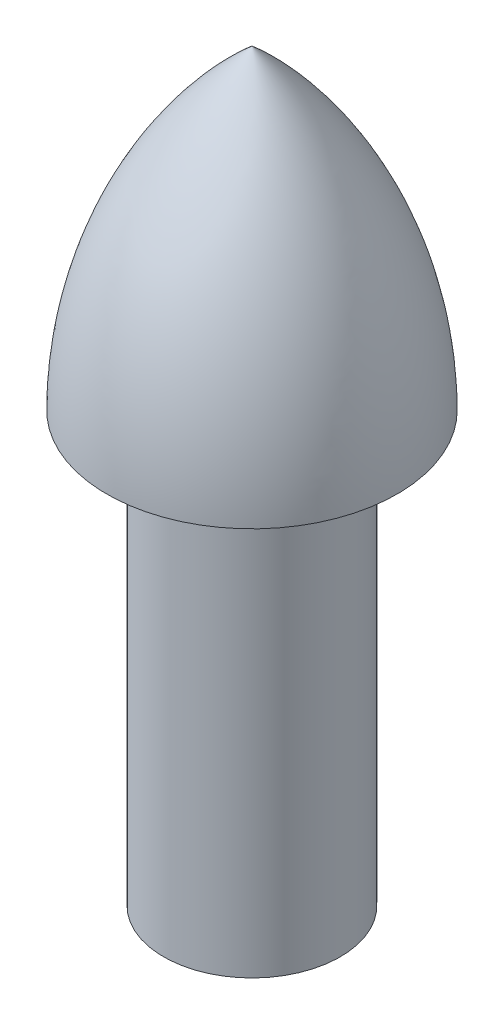
ISO-10303-21;
HEADER;
FILE_DESCRIPTION(('STEP AP214'),'2;1');
FILE_NAME('part.step','',(''),(''),'','','');
FILE_SCHEMA(('AUTOMOTIVE_DESIGN { 1 0 10303 214 1 1 1 1 }'));
ENDSEC;
DATA;
#1=APPLICATION_CONTEXT('core data for automotive mechanical design processes');
#2=APPLICATION_PROTOCOL_DEFINITION('international standard','automotive_design',2000,#1);
#3=PRODUCT_CONTEXT('',#1,'mechanical');
#4=PRODUCT('Part','Part','',(#3));
#5=PRODUCT_RELATED_PRODUCT_CATEGORY('part','',(#4));
#6=PRODUCT_DEFINITION_FORMATION('','',#4);
#7=PRODUCT_DEFINITION_CONTEXT('part definition',#1,'design');
#8=PRODUCT_DEFINITION('design','',#6,#7);
#9=PRODUCT_DEFINITION_SHAPE('','',#8);
#10=(LENGTH_UNIT() NAMED_UNIT(*) SI_UNIT(.MILLI.,.METRE.));
#11=(NAMED_UNIT(*) PLANE_ANGLE_UNIT() SI_UNIT($,.RADIAN.));
#12=(NAMED_UNIT(*) SI_UNIT($,.STERADIAN.) SOLID_ANGLE_UNIT());
#13=UNCERTAINTY_MEASURE_WITH_UNIT(LENGTH_MEASURE(1.E-05),#10,'distance_accuracy_value','');
#14=(GEOMETRIC_REPRESENTATION_CONTEXT(3) GLOBAL_UNCERTAINTY_ASSIGNED_CONTEXT((#13)) GLOBAL_UNIT_ASSIGNED_CONTEXT((#10,
#11,#12)) REPRESENTATION_CONTEXT('',''));
#15=CARTESIAN_POINT('',(0.,0.,0.));
#16=DIRECTION('',(0.,0.,1.));
#17=DIRECTION('',(1.,0.,0.));
#18=AXIS2_PLACEMENT_3D('',#15,#16,#17);
#19=CARTESIAN_POINT('',(0.,-0.0750000000000004,10.875));
#20=DIRECTION('',(-1.,0.,0.));
#21=DIRECTION('',(0.,0.,-1.));
#22=AXIS2_PLACEMENT_3D('',#19,#20,#21);
#23=CIRCLE('',#22,15.6251691720716);
#24=TRIMMED_CURVE('',#23,(PARAMETER_VALUE(-0.80099518215353)),
(PARAMETER_VALUE(0.80099518215353)),.T.,.PARAMETER.);
#25=CARTESIAN_POINT('',(0.,-0.0750000000000004,0.));
#26=DIRECTION('',(0.,-1.,0.));
#27=AXIS1_PLACEMENT('',#25,#26);
#28=SURFACE_OF_REVOLUTION('',#24,#27);
#29=CARTESIAN_POINT('',(0.,1.,0.));
#30=DIRECTION('',(0.,-1.,0.));
#31=DIRECTION('',(0.,0.,-1.));
#32=AXIS2_PLACEMENT_3D('',#29,#30,#31);
#33=CIRCLE('',#32,4.71314570934775);
#34=CARTESIAN_POINT('',(0.,1.,-4.71314570934775));
#35=VERTEX_POINT('',#34);
#36=EDGE_CURVE('E42',#35,#35,#33,.T.);
#37=ORIENTED_EDGE('',*,*,#36,.T.);
#38=EDGE_LOOP('',(#37));
#39=FACE_BOUND('',#38,.T.);
#40=CARTESIAN_POINT('',(0.,11.1446384369487,0.));
#41=VERTEX_POINT('',#40);
#42=VERTEX_LOOP('',#41);
#43=FACE_BOUND('',#42,.T.);
#44=ADVANCED_FACE('F34',(#39,#43),#28,.F.);
#45=CARTESIAN_POINT('',(0.,1.,0.));
#46=DIRECTION('',(0.,1.,0.));
#47=DIRECTION('',(0.,0.,1.));
#48=AXIS2_PLACEMENT_3D('',#45,#46,#47);
#49=PLANE('',#48);
#50=CARTESIAN_POINT('',(0.,0.999999999999997,0.));
#51=DIRECTION('',(0.,-1.,0.));
#52=DIRECTION('',(0.,0.,-1.));
#53=AXIS2_PLACEMENT_3D('',#50,#51,#52);
#54=CIRCLE('',#53,2.25);
#55=CARTESIAN_POINT('',(0.,0.999999999999997,-2.25));
#56=VERTEX_POINT('',#55);
#57=EDGE_CURVE('E62',#56,#56,#54,.T.);
#58=ORIENTED_EDGE('',*,*,#57,.T.);
#59=EDGE_LOOP('',(#58));
#60=FACE_BOUND('',#59,.T.);
#61=ORIENTED_EDGE('',*,*,#36,.F.);
#62=EDGE_LOOP('',(#61));
#63=FACE_BOUND('',#62,.T.);
#64=ADVANCED_FACE('F74',(#60,#63),#49,.T.);
#65=CARTESIAN_POINT('',(0.,0.999999999999997,0.));
#66=DIRECTION('',(0.,-1.,0.));
#67=DIRECTION('',(0.,0.,-1.));
#68=AXIS2_PLACEMENT_3D('',#65,#66,#67);
#69=CYLINDRICAL_SURFACE('',#68,2.25);
#70=ORIENTED_EDGE('',*,*,#57,.F.);
#71=EDGE_LOOP('',(#70));
#72=FACE_BOUND('',#71,.T.);
#73=CARTESIAN_POINT('',(0.,-17.,0.));
#74=DIRECTION('',(0.,-1.,0.));
#75=DIRECTION('',(0.,0.,-1.));
#76=AXIS2_PLACEMENT_3D('',#73,#74,#75);
#77=CIRCLE('',#76,2.25);
#78=CARTESIAN_POINT('',(0.,-17.,-2.25));
#79=VERTEX_POINT('',#78);
#80=EDGE_CURVE('E67',#79,#79,#77,.T.);
#81=ORIENTED_EDGE('',*,*,#80,.T.);
#82=EDGE_LOOP('',(#81));
#83=FACE_BOUND('',#82,.T.);
#84=ADVANCED_FACE('F56',(#72,#83),#69,.F.);
#85=CARTESIAN_POINT('',(0.,0.,0.));
#86=DIRECTION('',(0.,-1.,0.));
#87=DIRECTION('',(0.,0.,-1.));
#88=AXIS2_PLACEMENT_3D('',#85,#86,#87);
#89=PLANE('',#88);
#90=CARTESIAN_POINT('',(0.,0.,0.));
#91=DIRECTION('',(0.,-1.,0.));
#92=DIRECTION('',(0.,0.,-1.));
#93=AXIS2_PLACEMENT_3D('',#90,#91,#92);
#94=CIRCLE('',#93,5.75);
#95=CARTESIAN_POINT('',(0.,0.,-5.75));
#96=VERTEX_POINT('',#95);
#97=EDGE_CURVE('E11',#96,#96,#94,.T.);
#98=ORIENTED_EDGE('',*,*,#97,.T.);
#99=EDGE_LOOP('',(#98));
#100=FACE_BOUND('',#99,.T.);
#101=CARTESIAN_POINT('',(0.,0.,0.));
#102=DIRECTION('',(0.,-1.,0.));
#103=DIRECTION('',(0.,0.,-1.));
#104=AXIS2_PLACEMENT_3D('',#101,#102,#103);
#105=CIRCLE('',#104,3.5);
#106=CARTESIAN_POINT('',(0.,0.,-3.5));
#107=VERTEX_POINT('',#106);
#108=EDGE_CURVE('E59',#107,#107,#105,.T.);
#109=ORIENTED_EDGE('',*,*,#108,.F.);
#110=EDGE_LOOP('',(#109));
#111=FACE_BOUND('',#110,.T.);
#112=ADVANCED_FACE('F36',(#100,#111),#89,.T.);
#113=CARTESIAN_POINT('',(0.,-0.0750000000000004,10.875));
#114=DIRECTION('',(-1.,0.,0.));
#115=DIRECTION('',(0.,0.,-1.));
#116=AXIS2_PLACEMENT_3D('',#113,#114,#115);
#117=CIRCLE('',#116,16.6251691720716);
#118=TRIMMED_CURVE('',#117,(PARAMETER_VALUE(-0.857766233845658)),
(PARAMETER_VALUE(0.857766233845658)),.T.,.PARAMETER.);
#119=CARTESIAN_POINT('',(0.,-0.0750000000000004,0.));
#120=DIRECTION('',(0.,-1.,0.));
#121=AXIS1_PLACEMENT('',#119,#120);
#122=SURFACE_OF_REVOLUTION('',#118,#121);
#123=CARTESIAN_POINT('',(0.,12.5,0.));
#124=VERTEX_POINT('',#123);
#125=VERTEX_LOOP('',#124);
#126=FACE_BOUND('',#125,.T.);
#127=ORIENTED_EDGE('',*,*,#97,.F.);
#128=EDGE_LOOP('',(#127));
#129=FACE_BOUND('',#128,.T.);
#130=ADVANCED_FACE('F48',(#126,#129),#122,.T.);
#131=CARTESIAN_POINT('',(0.,-17.,0.));
#132=DIRECTION('',(0.,1.,0.));
#133=DIRECTION('',(0.,0.,1.));
#134=AXIS2_PLACEMENT_3D('',#131,#132,#133);
#135=CYLINDRICAL_SURFACE('',#134,3.5);
#136=CARTESIAN_POINT('',(0.,-17.,0.));
#137=DIRECTION('',(0.,-1.,0.));
#138=DIRECTION('',(0.,0.,-1.));
#139=AXIS2_PLACEMENT_3D('',#136,#137,#138);
#140=CIRCLE('',#139,3.5);
#141=CARTESIAN_POINT('',(0.,-17.,-3.5));
#142=VERTEX_POINT('',#141);
#143=EDGE_CURVE('E61',#142,#142,#140,.T.);
#144=ORIENTED_EDGE('',*,*,#143,.F.);
#145=EDGE_LOOP('',(#144));
#146=FACE_BOUND('',#145,.T.);
#147=ORIENTED_EDGE('',*,*,#108,.T.);
#148=EDGE_LOOP('',(#147));
#149=FACE_BOUND('',#148,.T.);
#150=ADVANCED_FACE('F51',(#146,#149),#135,.T.);
#151=CARTESIAN_POINT('',(0.,-17.,0.));
#152=DIRECTION('',(0.,-1.,0.));
#153=DIRECTION('',(0.,0.,-1.));
#154=AXIS2_PLACEMENT_3D('',#151,#152,#153);
#155=PLANE('',#154);
#156=ORIENTED_EDGE('',*,*,#80,.F.);
#157=EDGE_LOOP('',(#156));
#158=FACE_BOUND('',#157,.T.);
#159=ORIENTED_EDGE('',*,*,#143,.T.);
#160=EDGE_LOOP('',(#159));
#161=FACE_BOUND('',#160,.T.);
#162=ADVANCED_FACE('F88',(#158,#161),#155,.T.);
#163=CLOSED_SHELL('',(#44,#64,#84,#112,#130,#150,#162));
#164=MANIFOLD_SOLID_BREP('B2',#163);
#165=ADVANCED_BREP_SHAPE_REPRESENTATION('',(#18,#164),#14);
#166=SHAPE_DEFINITION_REPRESENTATION(#9,#165);
ENDSEC;
END-ISO-10303-21;
